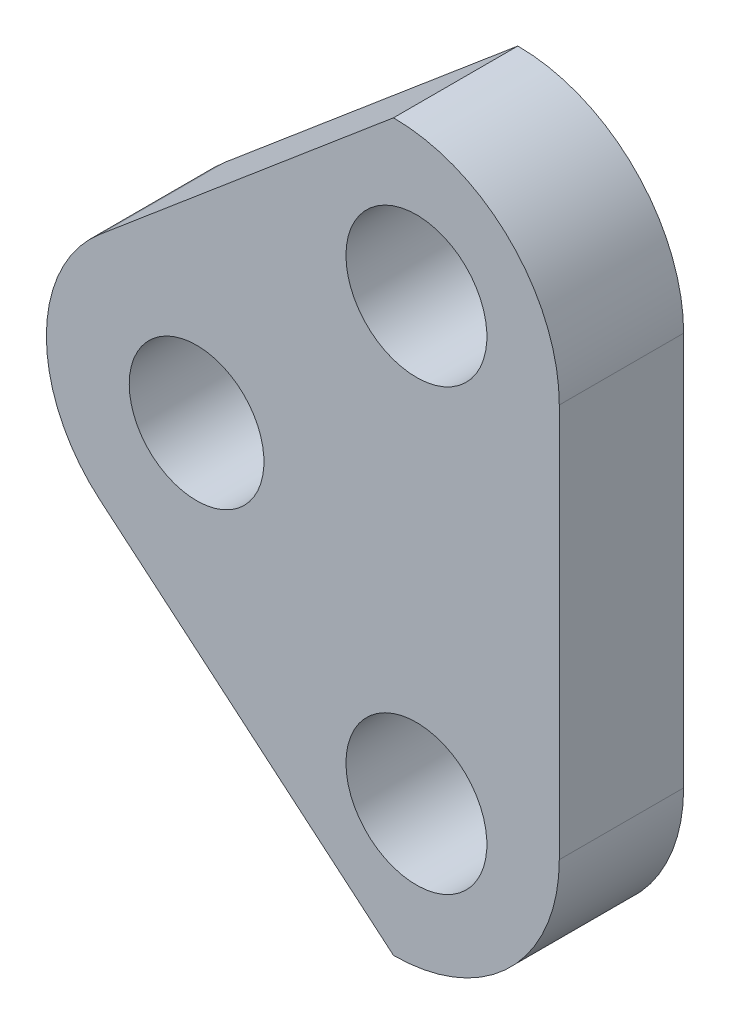
ISO-10303-21;
HEADER;
FILE_DESCRIPTION(('STEP AP214'),'2;1');
FILE_NAME('part.step','',(''),(''),'','','');
FILE_SCHEMA(('AUTOMOTIVE_DESIGN { 1 0 10303 214 1 1 1 1 }'));
ENDSEC;
DATA;
#1=APPLICATION_CONTEXT('core data for automotive mechanical design processes');
#2=APPLICATION_PROTOCOL_DEFINITION('international standard','automotive_design',2000,#1);
#3=PRODUCT_CONTEXT('',#1,'mechanical');
#4=PRODUCT('Part','Part','',(#3));
#5=PRODUCT_RELATED_PRODUCT_CATEGORY('part','',(#4));
#6=PRODUCT_DEFINITION_FORMATION('','',#4);
#7=PRODUCT_DEFINITION_CONTEXT('part definition',#1,'design');
#8=PRODUCT_DEFINITION('design','',#6,#7);
#9=PRODUCT_DEFINITION_SHAPE('','',#8);
#10=(LENGTH_UNIT() NAMED_UNIT(*) SI_UNIT(.MILLI.,.METRE.));
#11=(NAMED_UNIT(*) PLANE_ANGLE_UNIT() SI_UNIT($,.RADIAN.));
#12=(NAMED_UNIT(*) SI_UNIT($,.STERADIAN.) SOLID_ANGLE_UNIT());
#13=UNCERTAINTY_MEASURE_WITH_UNIT(LENGTH_MEASURE(1.E-05),#10,'distance_accuracy_value','');
#14=(GEOMETRIC_REPRESENTATION_CONTEXT(3) GLOBAL_UNCERTAINTY_ASSIGNED_CONTEXT((#13)) GLOBAL_UNIT_ASSIGNED_CONTEXT((#10,
#11,#12)) REPRESENTATION_CONTEXT('',''));
#15=CARTESIAN_POINT('',(0.,0.,0.));
#16=DIRECTION('',(0.,0.,1.));
#17=DIRECTION('',(1.,0.,0.));
#18=AXIS2_PLACEMENT_3D('',#15,#16,#17);
#19=CARTESIAN_POINT('',(0.,0.,0.));
#20=DIRECTION('',(0.,0.,-1.));
#21=DIRECTION('',(1.,0.,0.));
#22=AXIS2_PLACEMENT_3D('',#19,#20,#21);
#23=PLANE('',#22);
#24=CARTESIAN_POINT('',(10.6066017177982,10.6066017177982,0.));
#25=DIRECTION('',(0.,0.,-1.));
#26=DIRECTION('',(-1.,0.,0.));
#27=AXIS2_PLACEMENT_3D('',#24,#25,#26);
#28=CIRCLE('',#27,3.4);
#29=CARTESIAN_POINT('',(7.20660171779821,10.6066017177982,0.));
#30=VERTEX_POINT('',#29);
#31=EDGE_CURVE('E135',#30,#30,#28,.T.);
#32=ORIENTED_EDGE('',*,*,#31,.T.);
#33=EDGE_LOOP('',(#32));
#34=FACE_BOUND('',#33,.T.);
#35=CARTESIAN_POINT('',(10.6066017177982,-10.6066017177982,0.));
#36=DIRECTION('',(0.,0.,-1.));
#37=DIRECTION('',(-1.,0.,0.));
#38=AXIS2_PLACEMENT_3D('',#35,#36,#37);
#39=CIRCLE('',#38,3.4);
#40=CARTESIAN_POINT('',(7.20660171779821,-10.6066017177982,0.));
#41=VERTEX_POINT('',#40);
#42=EDGE_CURVE('E186',#41,#41,#39,.T.);
#43=ORIENTED_EDGE('',*,*,#42,.T.);
#44=EDGE_LOOP('',(#43));
#45=FACE_BOUND('',#44,.T.);
#46=DIRECTION('',(0.764288364597995,-0.644874635677449,0.));
#47=VECTOR('',#46,1.);
#48=CARTESIAN_POINT('',(-4.67452685224013,-5.54012560815774,0.));
#49=LINE('',#48,#47);
#50=CARTESIAN_POINT('',(-4.67452685224013,-5.54012560815774,0.));
#51=VERTEX_POINT('',#50);
#52=CARTESIAN_POINT('',(9.5,-17.5,0.));
#53=VERTEX_POINT('',#52);
#54=EDGE_CURVE('E165',#51,#53,#49,.T.);
#55=ORIENTED_EDGE('',*,*,#54,.T.);
#56=CARTESIAN_POINT('',(9.5,-9.50000000000001,0.));
#57=DIRECTION('',(0.,0.,1.));
#58=DIRECTION('',(1.,0.,0.));
#59=AXIS2_PLACEMENT_3D('',#56,#57,#58);
#60=CIRCLE('',#59,8.);
#61=CARTESIAN_POINT('',(17.5,-9.50000000000001,0.));
#62=VERTEX_POINT('',#61);
#63=EDGE_CURVE('E110',#53,#62,#60,.T.);
#64=ORIENTED_EDGE('',*,*,#63,.T.);
#65=DIRECTION('',(0.,1.,0.));
#66=VECTOR('',#65,1.);
#67=CARTESIAN_POINT('',(17.5,0.,0.));
#68=LINE('',#67,#66);
#69=CARTESIAN_POINT('',(17.5,9.5,0.));
#70=VERTEX_POINT('',#69);
#71=EDGE_CURVE('E148',#62,#70,#68,.T.);
#72=ORIENTED_EDGE('',*,*,#71,.T.);
#73=CARTESIAN_POINT('',(9.5,9.5,0.));
#74=DIRECTION('',(0.,0.,1.));
#75=DIRECTION('',(1.,0.,0.));
#76=AXIS2_PLACEMENT_3D('',#73,#74,#75);
#77=CIRCLE('',#76,8.);
#78=CARTESIAN_POINT('',(9.5,17.5,0.));
#79=VERTEX_POINT('',#78);
#80=EDGE_CURVE('E152',#70,#79,#77,.T.);
#81=ORIENTED_EDGE('',*,*,#80,.T.);
#82=DIRECTION('',(-0.764288364597995,-0.644874635677448,0.));
#83=VECTOR('',#82,1.);
#84=CARTESIAN_POINT('',(-4.67452685224013,5.54012560815774,0.));
#85=LINE('',#84,#83);
#86=CARTESIAN_POINT('',(-4.67452685224013,5.54012560815774,0.));
#87=VERTEX_POINT('',#86);
#88=EDGE_CURVE('E181',#79,#87,#85,.T.);
#89=ORIENTED_EDGE('',*,*,#88,.T.);
#90=CARTESIAN_POINT('',(0.,0.,0.));
#91=DIRECTION('',(0.,0.,1.));
#92=DIRECTION('',(1.,0.,0.));
#93=AXIS2_PLACEMENT_3D('',#90,#91,#92);
#94=CIRCLE('',#93,7.24873734152916);
#95=EDGE_CURVE('E167',#87,#51,#94,.T.);
#96=ORIENTED_EDGE('',*,*,#95,.T.);
#97=EDGE_LOOP('',(#55,#64,#72,#81,#89,#96));
#98=FACE_BOUND('',#97,.T.);
#99=CARTESIAN_POINT('',(0.,0.,0.));
#100=DIRECTION('',(0.,0.,-1.));
#101=DIRECTION('',(-1.,0.,0.));
#102=AXIS2_PLACEMENT_3D('',#99,#100,#101);
#103=CIRCLE('',#102,3.25);
#104=CARTESIAN_POINT('',(-3.25,0.,0.));
#105=VERTEX_POINT('',#104);
#106=EDGE_CURVE('E298',#105,#105,#103,.T.);
#107=ORIENTED_EDGE('',*,*,#106,.T.);
#108=EDGE_LOOP('',(#107));
#109=FACE_BOUND('',#108,.T.);
#110=ADVANCED_FACE('F49',(#34,#45,#98,#109),#23,.F.);
#111=CARTESIAN_POINT('',(9.5,9.5,-6.));
#112=DIRECTION('',(0.,0.,-1.));
#113=DIRECTION('',(1.,0.,0.));
#114=AXIS2_PLACEMENT_3D('',#111,#112,#113);
#115=PLANE('',#114);
#116=CARTESIAN_POINT('',(10.6066017177982,10.6066017177982,-6.));
#117=DIRECTION('',(0.,0.,1.));
#118=DIRECTION('',(1.,0.,0.));
#119=AXIS2_PLACEMENT_3D('',#116,#117,#118);
#120=CIRCLE('',#119,3.4);
#121=CARTESIAN_POINT('',(14.0066017177982,10.6066017177982,-6.));
#122=VERTEX_POINT('',#121);
#123=EDGE_CURVE('E142',#122,#122,#120,.T.);
#124=ORIENTED_EDGE('',*,*,#123,.T.);
#125=EDGE_LOOP('',(#124));
#126=FACE_BOUND('',#125,.T.);
#127=CARTESIAN_POINT('',(10.6066017177982,-10.6066017177982,-6.));
#128=DIRECTION('',(0.,0.,1.));
#129=DIRECTION('',(1.,0.,0.));
#130=AXIS2_PLACEMENT_3D('',#127,#128,#129);
#131=CIRCLE('',#130,3.4);
#132=CARTESIAN_POINT('',(14.0066017177982,-10.6066017177982,-6.));
#133=VERTEX_POINT('',#132);
#134=EDGE_CURVE('E132',#133,#133,#131,.T.);
#135=ORIENTED_EDGE('',*,*,#134,.T.);
#136=EDGE_LOOP('',(#135));
#137=FACE_BOUND('',#136,.T.);
#138=CARTESIAN_POINT('',(0.,0.,-6.));
#139=DIRECTION('',(0.,0.,1.));
#140=DIRECTION('',(1.,0.,0.));
#141=AXIS2_PLACEMENT_3D('',#138,#139,#140);
#142=CIRCLE('',#141,7.24873734152916);
#143=CARTESIAN_POINT('',(-4.67452685224013,5.54012560815774,-6.));
#144=VERTEX_POINT('',#143);
#145=CARTESIAN_POINT('',(-4.67452685224013,-5.54012560815774,-6.));
#146=VERTEX_POINT('',#145);
#147=EDGE_CURVE('E169',#144,#146,#142,.T.);
#148=ORIENTED_EDGE('',*,*,#147,.F.);
#149=DIRECTION('',(-0.764288364597995,-0.644874635677448,0.));
#150=VECTOR('',#149,1.);
#151=CARTESIAN_POINT('',(-4.67452685224013,5.54012560815774,-6.));
#152=LINE('',#151,#150);
#153=CARTESIAN_POINT('',(9.5,17.5,-6.));
#154=VERTEX_POINT('',#153);
#155=EDGE_CURVE('E173',#154,#144,#152,.T.);
#156=ORIENTED_EDGE('',*,*,#155,.F.);
#157=CARTESIAN_POINT('',(9.5,9.5,-6.));
#158=DIRECTION('',(0.,0.,1.));
#159=DIRECTION('',(1.,0.,0.));
#160=AXIS2_PLACEMENT_3D('',#157,#158,#159);
#161=CIRCLE('',#160,8.);
#162=CARTESIAN_POINT('',(17.5,9.5,-6.));
#163=VERTEX_POINT('',#162);
#164=EDGE_CURVE('E128',#163,#154,#161,.T.);
#165=ORIENTED_EDGE('',*,*,#164,.F.);
#166=DIRECTION('',(0.,1.,0.));
#167=VECTOR('',#166,1.);
#168=CARTESIAN_POINT('',(17.5,-9.50000000000001,-6.));
#169=LINE('',#168,#167);
#170=CARTESIAN_POINT('',(17.5,-9.50000000000001,-6.));
#171=VERTEX_POINT('',#170);
#172=EDGE_CURVE('E126',#171,#163,#169,.T.);
#173=ORIENTED_EDGE('',*,*,#172,.F.);
#174=CARTESIAN_POINT('',(9.5,-9.50000000000001,-6.));
#175=DIRECTION('',(0.,0.,1.));
#176=DIRECTION('',(1.,0.,0.));
#177=AXIS2_PLACEMENT_3D('',#174,#175,#176);
#178=CIRCLE('',#177,8.);
#179=CARTESIAN_POINT('',(9.5,-17.5,-6.));
#180=VERTEX_POINT('',#179);
#181=EDGE_CURVE('E107',#180,#171,#178,.T.);
#182=ORIENTED_EDGE('',*,*,#181,.F.);
#183=DIRECTION('',(0.764288364597995,-0.644874635677449,0.));
#184=VECTOR('',#183,1.);
#185=CARTESIAN_POINT('',(-4.67452685224013,-5.54012560815774,-6.));
#186=LINE('',#185,#184);
#187=EDGE_CURVE('E115',#146,#180,#186,.T.);
#188=ORIENTED_EDGE('',*,*,#187,.F.);
#189=EDGE_LOOP('',(#148,#156,#165,#173,#182,#188));
#190=FACE_BOUND('',#189,.T.);
#191=CARTESIAN_POINT('',(0.,0.,-6.));
#192=DIRECTION('',(0.,0.,-1.));
#193=DIRECTION('',(-1.,0.,0.));
#194=AXIS2_PLACEMENT_3D('',#191,#192,#193);
#195=CIRCLE('',#194,3.25);
#196=CARTESIAN_POINT('',(-3.25,0.,-6.));
#197=VERTEX_POINT('',#196);
#198=EDGE_CURVE('E121',#197,#197,#195,.T.);
#199=ORIENTED_EDGE('',*,*,#198,.F.);
#200=EDGE_LOOP('',(#199));
#201=FACE_BOUND('',#200,.T.);
#202=ADVANCED_FACE('F123',(#126,#137,#190,#201),#115,.T.);
#203=CARTESIAN_POINT('',(9.5,-9.50000000000001,-11.));
#204=DIRECTION('',(0.,0.,1.));
#205=DIRECTION('',(-1.,0.,0.));
#206=AXIS2_PLACEMENT_3D('',#203,#204,#205);
#207=CYLINDRICAL_SURFACE('',#206,8.);
#208=ORIENTED_EDGE('',*,*,#181,.T.);
#209=DIRECTION('',(0.,0.,1.));
#210=VECTOR('',#209,1.);
#211=CARTESIAN_POINT('',(17.5,-9.50000000000001,-11.));
#212=LINE('',#211,#210);
#213=EDGE_CURVE('E58',#171,#62,#212,.T.);
#214=ORIENTED_EDGE('',*,*,#213,.T.);
#215=ORIENTED_EDGE('',*,*,#63,.F.);
#216=DIRECTION('',(0.,0.,1.));
#217=VECTOR('',#216,1.);
#218=CARTESIAN_POINT('',(9.5,-17.5,-11.));
#219=LINE('',#218,#217);
#220=EDGE_CURVE('E11',#180,#53,#219,.T.);
#221=ORIENTED_EDGE('',*,*,#220,.F.);
#222=EDGE_LOOP('',(#208,#214,#215,#221));
#223=FACE_BOUND('',#222,.T.);
#224=ADVANCED_FACE('F105',(#223),#207,.T.);
#225=CARTESIAN_POINT('',(17.5,0.,-11.));
#226=DIRECTION('',(-1.,0.,0.));
#227=DIRECTION('',(0.,0.,-1.));
#228=AXIS2_PLACEMENT_3D('',#225,#226,#227);
#229=PLANE('',#228);
#230=ORIENTED_EDGE('',*,*,#172,.T.);
#231=DIRECTION('',(0.,0.,1.));
#232=VECTOR('',#231,1.);
#233=CARTESIAN_POINT('',(17.5,9.5,-11.));
#234=LINE('',#233,#232);
#235=EDGE_CURVE('E73',#163,#70,#234,.T.);
#236=ORIENTED_EDGE('',*,*,#235,.T.);
#237=ORIENTED_EDGE('',*,*,#71,.F.);
#238=ORIENTED_EDGE('',*,*,#213,.F.);
#239=EDGE_LOOP('',(#230,#236,#237,#238));
#240=FACE_BOUND('',#239,.T.);
#241=ADVANCED_FACE('F161',(#240),#229,.F.);
#242=CARTESIAN_POINT('',(9.5,9.5,-11.));
#243=DIRECTION('',(0.,0.,1.));
#244=DIRECTION('',(-1.,0.,0.));
#245=AXIS2_PLACEMENT_3D('',#242,#243,#244);
#246=CYLINDRICAL_SURFACE('',#245,8.);
#247=ORIENTED_EDGE('',*,*,#164,.T.);
#248=DIRECTION('',(0.,0.,1.));
#249=VECTOR('',#248,1.);
#250=CARTESIAN_POINT('',(9.5,17.5,-11.));
#251=LINE('',#250,#249);
#252=EDGE_CURVE('E156',#154,#79,#251,.T.);
#253=ORIENTED_EDGE('',*,*,#252,.T.);
#254=ORIENTED_EDGE('',*,*,#80,.F.);
#255=ORIENTED_EDGE('',*,*,#235,.F.);
#256=EDGE_LOOP('',(#247,#253,#254,#255));
#257=FACE_BOUND('',#256,.T.);
#258=ADVANCED_FACE('F196',(#257),#246,.T.);
#259=CARTESIAN_POINT('',(10.6066017177982,-10.6066017177982,-11.));
#260=DIRECTION('',(0.,0.,1.));
#261=DIRECTION('',(-1.,0.,0.));
#262=AXIS2_PLACEMENT_3D('',#259,#260,#261);
#263=CYLINDRICAL_SURFACE('',#262,3.4);
#264=ORIENTED_EDGE('',*,*,#134,.F.);
#265=EDGE_LOOP('',(#264));
#266=FACE_BOUND('',#265,.T.);
#267=ORIENTED_EDGE('',*,*,#42,.F.);
#268=EDGE_LOOP('',(#267));
#269=FACE_BOUND('',#268,.T.);
#270=ADVANCED_FACE('F51',(#266,#269),#263,.F.);
#271=CARTESIAN_POINT('',(10.6066017177982,10.6066017177982,-11.));
#272=DIRECTION('',(0.,0.,1.));
#273=DIRECTION('',(-1.,0.,0.));
#274=AXIS2_PLACEMENT_3D('',#271,#272,#273);
#275=CYLINDRICAL_SURFACE('',#274,3.4);
#276=ORIENTED_EDGE('',*,*,#123,.F.);
#277=EDGE_LOOP('',(#276));
#278=FACE_BOUND('',#277,.T.);
#279=ORIENTED_EDGE('',*,*,#31,.F.);
#280=EDGE_LOOP('',(#279));
#281=FACE_BOUND('',#280,.T.);
#282=ADVANCED_FACE('F195',(#278,#281),#275,.F.);
#283=CARTESIAN_POINT('',(0.,0.,4.));
#284=DIRECTION('',(0.,0.,-1.));
#285=DIRECTION('',(1.,0.,0.));
#286=AXIS2_PLACEMENT_3D('',#283,#284,#285);
#287=CYLINDRICAL_SURFACE('',#286,7.24873734152916);
#288=ORIENTED_EDGE('',*,*,#95,.F.);
#289=DIRECTION('',(0.,0.,-1.));
#290=VECTOR('',#289,1.);
#291=CARTESIAN_POINT('',(-4.67452685224013,5.54012560815774,4.));
#292=LINE('',#291,#290);
#293=EDGE_CURVE('E65',#87,#144,#292,.T.);
#294=ORIENTED_EDGE('',*,*,#293,.T.);
#295=ORIENTED_EDGE('',*,*,#147,.T.);
#296=DIRECTION('',(0.,0.,-1.));
#297=VECTOR('',#296,1.);
#298=CARTESIAN_POINT('',(-4.67452685224013,-5.54012560815774,4.));
#299=LINE('',#298,#297);
#300=EDGE_CURVE('E117',#51,#146,#299,.T.);
#301=ORIENTED_EDGE('',*,*,#300,.F.);
#302=EDGE_LOOP('',(#288,#294,#295,#301));
#303=FACE_BOUND('',#302,.T.);
#304=ADVANCED_FACE('F202',(#303),#287,.T.);
#305=CARTESIAN_POINT('',(-4.67452685224013,5.54012560815774,4.));
#306=DIRECTION('',(-0.644874635677448,0.764288364597995,0.));
#307=DIRECTION('',(-0.764288364597995,-0.644874635677448,0.));
#308=AXIS2_PLACEMENT_3D('',#305,#306,#307);
#309=PLANE('',#308);
#310=ORIENTED_EDGE('',*,*,#88,.F.);
#311=ORIENTED_EDGE('',*,*,#252,.F.);
#312=ORIENTED_EDGE('',*,*,#155,.T.);
#313=ORIENTED_EDGE('',*,*,#293,.F.);
#314=EDGE_LOOP('',(#310,#311,#312,#313));
#315=FACE_BOUND('',#314,.T.);
#316=ADVANCED_FACE('F262',(#315),#309,.T.);
#317=CARTESIAN_POINT('',(-4.67452685224013,-5.54012560815774,4.));
#318=DIRECTION('',(-0.644874635677449,-0.764288364597995,0.));
#319=DIRECTION('',(0.764288364597995,-0.644874635677449,0.));
#320=AXIS2_PLACEMENT_3D('',#317,#318,#319);
#321=PLANE('',#320);
#322=ORIENTED_EDGE('',*,*,#54,.F.);
#323=ORIENTED_EDGE('',*,*,#300,.T.);
#324=ORIENTED_EDGE('',*,*,#187,.T.);
#325=ORIENTED_EDGE('',*,*,#220,.T.);
#326=EDGE_LOOP('',(#322,#323,#324,#325));
#327=FACE_BOUND('',#326,.T.);
#328=ADVANCED_FACE('F116',(#327),#321,.T.);
#329=CARTESIAN_POINT('',(0.,0.,-6.));
#330=DIRECTION('',(0.,0.,1.));
#331=DIRECTION('',(-1.,0.,0.));
#332=AXIS2_PLACEMENT_3D('',#329,#330,#331);
#333=CYLINDRICAL_SURFACE('',#332,3.25);
#334=ORIENTED_EDGE('',*,*,#198,.T.);
#335=EDGE_LOOP('',(#334));
#336=FACE_BOUND('',#335,.T.);
#337=ORIENTED_EDGE('',*,*,#106,.F.);
#338=EDGE_LOOP('',(#337));
#339=FACE_BOUND('',#338,.T.);
#340=ADVANCED_FACE('F281',(#336,#339),#333,.F.);
#341=CLOSED_SHELL('',(#110,#202,#224,#241,#258,#270,#282,#304,#316,#328,#340));
#342=MANIFOLD_SOLID_BREP('B2',#341);
#343=ADVANCED_BREP_SHAPE_REPRESENTATION('',(#18,#342),#14);
#344=SHAPE_DEFINITION_REPRESENTATION(#9,#343);
ENDSEC;
END-ISO-10303-21;
